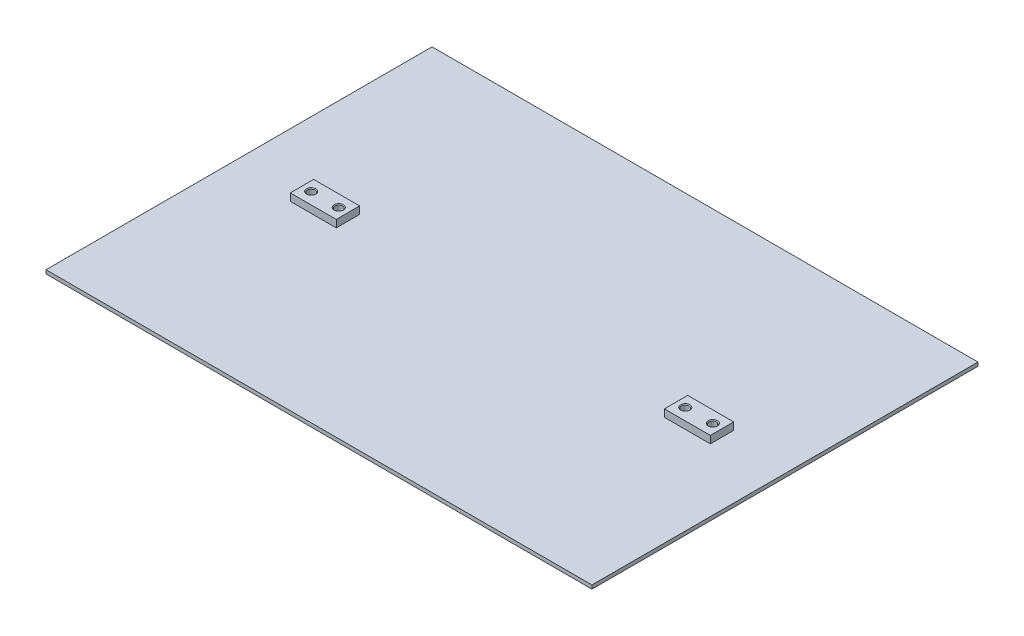
ISO-10303-21;
HEADER;
FILE_DESCRIPTION(('STEP AP214'),'2;1');
FILE_NAME('part.step','',(''),(''),'','','');
FILE_SCHEMA(('AUTOMOTIVE_DESIGN { 1 0 10303 214 1 1 1 1 }'));
ENDSEC;
DATA;
#1=APPLICATION_CONTEXT('core data for automotive mechanical design processes');
#2=APPLICATION_PROTOCOL_DEFINITION('international standard','automotive_design',2000,#1);
#3=PRODUCT_CONTEXT('',#1,'mechanical');
#4=PRODUCT('Part','Part','',(#3));
#5=PRODUCT_RELATED_PRODUCT_CATEGORY('part','',(#4));
#6=PRODUCT_DEFINITION_FORMATION('','',#4);
#7=PRODUCT_DEFINITION_CONTEXT('part definition',#1,'design');
#8=PRODUCT_DEFINITION('design','',#6,#7);
#9=PRODUCT_DEFINITION_SHAPE('','',#8);
#10=(LENGTH_UNIT() NAMED_UNIT(*) SI_UNIT(.MILLI.,.METRE.));
#11=(NAMED_UNIT(*) PLANE_ANGLE_UNIT() SI_UNIT($,.RADIAN.));
#12=(NAMED_UNIT(*) SI_UNIT($,.STERADIAN.) SOLID_ANGLE_UNIT());
#13=UNCERTAINTY_MEASURE_WITH_UNIT(LENGTH_MEASURE(1.E-05),#10,'distance_accuracy_value','');
#14=(GEOMETRIC_REPRESENTATION_CONTEXT(3) GLOBAL_UNCERTAINTY_ASSIGNED_CONTEXT((#13)) GLOBAL_UNIT_ASSIGNED_CONTEXT((#10,
#11,#12)) REPRESENTATION_CONTEXT('',''));
#15=CARTESIAN_POINT('',(0.,0.,0.));
#16=DIRECTION('',(0.,0.,1.));
#17=DIRECTION('',(1.,0.,0.));
#18=AXIS2_PLACEMENT_3D('',#15,#16,#17);
#19=CARTESIAN_POINT('',(0.,2.,0.));
#20=DIRECTION('',(0.,-1.,0.));
#21=DIRECTION('',(0.,0.,-1.));
#22=AXIS2_PLACEMENT_3D('',#19,#20,#21);
#23=PLANE('',#22);
#24=DIRECTION('',(0.,0.,-1.));
#25=VECTOR('',#24,1.);
#26=CARTESIAN_POINT('',(114.25,2.,6.35));
#27=LINE('',#26,#25);
#28=CARTESIAN_POINT('',(114.25,2.,6.35));
#29=VERTEX_POINT('',#28);
#30=CARTESIAN_POINT('',(114.25,2.,-6.35));
#31=VERTEX_POINT('',#30);
#32=EDGE_CURVE('E147',#29,#31,#27,.T.);
#33=ORIENTED_EDGE('',*,*,#32,.F.);
#34=DIRECTION('',(1.,0.,0.));
#35=VECTOR('',#34,1.);
#36=CARTESIAN_POINT('',(89.25,2.,6.35));
#37=LINE('',#36,#35);
#38=CARTESIAN_POINT('',(89.25,2.,6.35));
#39=VERTEX_POINT('',#38);
#40=EDGE_CURVE('E190',#39,#29,#37,.T.);
#41=ORIENTED_EDGE('',*,*,#40,.F.);
#42=DIRECTION('',(0.,0.,1.));
#43=VECTOR('',#42,1.);
#44=CARTESIAN_POINT('',(89.25,2.,6.35));
#45=LINE('',#44,#43);
#46=CARTESIAN_POINT('',(89.25,2.,-6.35));
#47=VERTEX_POINT('',#46);
#48=EDGE_CURVE('E207',#47,#39,#45,.T.);
#49=ORIENTED_EDGE('',*,*,#48,.F.);
#50=DIRECTION('',(-1.,0.,0.));
#51=VECTOR('',#50,1.);
#52=CARTESIAN_POINT('',(89.25,2.,-6.35));
#53=LINE('',#52,#51);
#54=EDGE_CURVE('E203',#31,#47,#53,.T.);
#55=ORIENTED_EDGE('',*,*,#54,.F.);
#56=EDGE_LOOP('',(#33,#41,#49,#55));
#57=FACE_BOUND('',#56,.T.);
#58=DIRECTION('',(0.,0.,-1.));
#59=VECTOR('',#58,1.);
#60=CARTESIAN_POINT('',(-148.5,2.,105.));
#61=LINE('',#60,#59);
#62=CARTESIAN_POINT('',(-148.5,2.,105.));
#63=VERTEX_POINT('',#62);
#64=CARTESIAN_POINT('',(-148.5,2.,-105.));
#65=VERTEX_POINT('',#64);
#66=EDGE_CURVE('E230',#63,#65,#61,.T.);
#67=ORIENTED_EDGE('',*,*,#66,.F.);
#68=DIRECTION('',(1.,0.,0.));
#69=VECTOR('',#68,1.);
#70=CARTESIAN_POINT('',(-148.5,2.,105.));
#71=LINE('',#70,#69);
#72=CARTESIAN_POINT('',(148.5,2.,105.));
#73=VERTEX_POINT('',#72);
#74=EDGE_CURVE('E242',#63,#73,#71,.T.);
#75=ORIENTED_EDGE('',*,*,#74,.T.);
#76=DIRECTION('',(0.,0.,-1.));
#77=VECTOR('',#76,1.);
#78=CARTESIAN_POINT('',(148.5,2.,105.));
#79=LINE('',#78,#77);
#80=CARTESIAN_POINT('',(148.5,2.,-105.));
#81=VERTEX_POINT('',#80);
#82=EDGE_CURVE('E239',#73,#81,#79,.T.);
#83=ORIENTED_EDGE('',*,*,#82,.T.);
#84=DIRECTION('',(1.,0.,0.));
#85=VECTOR('',#84,1.);
#86=CARTESIAN_POINT('',(-148.5,2.,-105.));
#87=LINE('',#86,#85);
#88=EDGE_CURVE('E234',#65,#81,#87,.T.);
#89=ORIENTED_EDGE('',*,*,#88,.F.);
#90=EDGE_LOOP('',(#67,#75,#83,#89));
#91=FACE_BOUND('',#90,.T.);
#92=DIRECTION('',(0.,0.,-1.));
#93=VECTOR('',#92,1.);
#94=CARTESIAN_POINT('',(-89.25,2.,6.35));
#95=LINE('',#94,#93);
#96=CARTESIAN_POINT('',(-89.25,2.,6.35));
#97=VERTEX_POINT('',#96);
#98=CARTESIAN_POINT('',(-89.25,2.,-6.35));
#99=VERTEX_POINT('',#98);
#100=EDGE_CURVE('E140',#97,#99,#95,.T.);
#101=ORIENTED_EDGE('',*,*,#100,.F.);
#102=DIRECTION('',(1.,0.,0.));
#103=VECTOR('',#102,1.);
#104=CARTESIAN_POINT('',(-89.25,2.,6.35));
#105=LINE('',#104,#103);
#106=CARTESIAN_POINT('',(-114.25,2.,6.35));
#107=VERTEX_POINT('',#106);
#108=EDGE_CURVE('E142',#107,#97,#105,.T.);
#109=ORIENTED_EDGE('',*,*,#108,.F.);
#110=DIRECTION('',(0.,0.,1.));
#111=VECTOR('',#110,1.);
#112=CARTESIAN_POINT('',(-114.25,2.,6.35));
#113=LINE('',#112,#111);
#114=CARTESIAN_POINT('',(-114.25,2.,-6.35));
#115=VERTEX_POINT('',#114);
#116=EDGE_CURVE('E76',#115,#107,#113,.T.);
#117=ORIENTED_EDGE('',*,*,#116,.F.);
#118=DIRECTION('',(-1.,0.,0.));
#119=VECTOR('',#118,1.);
#120=CARTESIAN_POINT('',(-89.25,2.,-6.35));
#121=LINE('',#120,#119);
#122=EDGE_CURVE('E71',#99,#115,#121,.T.);
#123=ORIENTED_EDGE('',*,*,#122,.F.);
#124=EDGE_LOOP('',(#101,#109,#117,#123));
#125=FACE_BOUND('',#124,.T.);
#126=ADVANCED_FACE('F53',(#57,#91,#125),#23,.F.);
#127=CARTESIAN_POINT('',(-148.5,2.,105.));
#128=DIRECTION('',(-1.,0.,0.));
#129=DIRECTION('',(0.,0.,1.));
#130=AXIS2_PLACEMENT_3D('',#127,#128,#129);
#131=PLANE('',#130);
#132=DIRECTION('',(0.,0.,-1.));
#133=VECTOR('',#132,1.);
#134=CARTESIAN_POINT('',(-148.5,0.,105.));
#135=LINE('',#134,#133);
#136=CARTESIAN_POINT('',(-148.5,0.,105.));
#137=VERTEX_POINT('',#136);
#138=CARTESIAN_POINT('',(-148.5,0.,-105.));
#139=VERTEX_POINT('',#138);
#140=EDGE_CURVE('E229',#137,#139,#135,.T.);
#141=ORIENTED_EDGE('',*,*,#140,.F.);
#142=DIRECTION('',(0.,-1.,0.));
#143=VECTOR('',#142,1.);
#144=CARTESIAN_POINT('',(-148.5,2.,105.));
#145=LINE('',#144,#143);
#146=EDGE_CURVE('E11',#63,#137,#145,.T.);
#147=ORIENTED_EDGE('',*,*,#146,.F.);
#148=ORIENTED_EDGE('',*,*,#66,.T.);
#149=DIRECTION('',(0.,-1.,0.));
#150=VECTOR('',#149,1.);
#151=CARTESIAN_POINT('',(-148.5,2.,-105.));
#152=LINE('',#151,#150);
#153=EDGE_CURVE('E57',#65,#139,#152,.T.);
#154=ORIENTED_EDGE('',*,*,#153,.T.);
#155=EDGE_LOOP('',(#141,#147,#148,#154));
#156=FACE_BOUND('',#155,.T.);
#157=ADVANCED_FACE('F55',(#156),#131,.T.);
#158=CARTESIAN_POINT('',(-148.5,2.,105.));
#159=DIRECTION('',(0.,0.,-1.));
#160=DIRECTION('',(-1.,0.,0.));
#161=AXIS2_PLACEMENT_3D('',#158,#159,#160);
#162=PLANE('',#161);
#163=DIRECTION('',(1.,0.,0.));
#164=VECTOR('',#163,1.);
#165=CARTESIAN_POINT('',(-148.5,0.,105.));
#166=LINE('',#165,#164);
#167=CARTESIAN_POINT('',(148.5,0.,105.));
#168=VERTEX_POINT('',#167);
#169=EDGE_CURVE('E235',#137,#168,#166,.T.);
#170=ORIENTED_EDGE('',*,*,#169,.T.);
#171=DIRECTION('',(0.,-1.,0.));
#172=VECTOR('',#171,1.);
#173=CARTESIAN_POINT('',(148.5,2.,105.));
#174=LINE('',#173,#172);
#175=EDGE_CURVE('E63',#73,#168,#174,.T.);
#176=ORIENTED_EDGE('',*,*,#175,.F.);
#177=ORIENTED_EDGE('',*,*,#74,.F.);
#178=ORIENTED_EDGE('',*,*,#146,.T.);
#179=EDGE_LOOP('',(#170,#176,#177,#178));
#180=FACE_BOUND('',#179,.T.);
#181=ADVANCED_FACE('F277',(#180),#162,.F.);
#182=CARTESIAN_POINT('',(148.5,2.,105.));
#183=DIRECTION('',(-1.,0.,0.));
#184=DIRECTION('',(0.,0.,1.));
#185=AXIS2_PLACEMENT_3D('',#182,#183,#184);
#186=PLANE('',#185);
#187=DIRECTION('',(0.,0.,-1.));
#188=VECTOR('',#187,1.);
#189=CARTESIAN_POINT('',(148.5,0.,105.));
#190=LINE('',#189,#188);
#191=CARTESIAN_POINT('',(148.5,0.,-105.));
#192=VERTEX_POINT('',#191);
#193=EDGE_CURVE('E252',#168,#192,#190,.T.);
#194=ORIENTED_EDGE('',*,*,#193,.T.);
#195=DIRECTION('',(0.,-1.,0.));
#196=VECTOR('',#195,1.);
#197=CARTESIAN_POINT('',(148.5,2.,-105.));
#198=LINE('',#197,#196);
#199=EDGE_CURVE('E260',#81,#192,#198,.T.);
#200=ORIENTED_EDGE('',*,*,#199,.F.);
#201=ORIENTED_EDGE('',*,*,#82,.F.);
#202=ORIENTED_EDGE('',*,*,#175,.T.);
#203=EDGE_LOOP('',(#194,#200,#201,#202));
#204=FACE_BOUND('',#203,.T.);
#205=ADVANCED_FACE('F281',(#204),#186,.F.);
#206=CARTESIAN_POINT('',(-148.5,2.,-105.));
#207=DIRECTION('',(0.,0.,-1.));
#208=DIRECTION('',(-1.,0.,0.));
#209=AXIS2_PLACEMENT_3D('',#206,#207,#208);
#210=PLANE('',#209);
#211=DIRECTION('',(1.,0.,0.));
#212=VECTOR('',#211,1.);
#213=CARTESIAN_POINT('',(-148.5,0.,-105.));
#214=LINE('',#213,#212);
#215=EDGE_CURVE('E248',#139,#192,#214,.T.);
#216=ORIENTED_EDGE('',*,*,#215,.F.);
#217=ORIENTED_EDGE('',*,*,#153,.F.);
#218=ORIENTED_EDGE('',*,*,#88,.T.);
#219=ORIENTED_EDGE('',*,*,#199,.T.);
#220=EDGE_LOOP('',(#216,#217,#218,#219));
#221=FACE_BOUND('',#220,.T.);
#222=ADVANCED_FACE('F270',(#221),#210,.T.);
#223=CARTESIAN_POINT('',(0.,0.,0.));
#224=DIRECTION('',(0.,-1.,0.));
#225=DIRECTION('',(0.,0.,-1.));
#226=AXIS2_PLACEMENT_3D('',#223,#224,#225);
#227=PLANE('',#226);
#228=CARTESIAN_POINT('',(109.25,0.,0.));
#229=DIRECTION('',(0.,1.,0.));
#230=DIRECTION('',(0.,0.,1.));
#231=AXIS2_PLACEMENT_3D('',#228,#229,#230);
#232=CIRCLE('',#231,2.1);
#233=CARTESIAN_POINT('',(109.25,0.,2.1));
#234=VERTEX_POINT('',#233);
#235=EDGE_CURVE('E576',#234,#234,#232,.T.);
#236=ORIENTED_EDGE('',*,*,#235,.T.);
#237=EDGE_LOOP('',(#236));
#238=FACE_BOUND('',#237,.T.);
#239=CARTESIAN_POINT('',(94.25,0.,0.));
#240=DIRECTION('',(0.,1.,0.));
#241=DIRECTION('',(0.,0.,1.));
#242=AXIS2_PLACEMENT_3D('',#239,#240,#241);
#243=CIRCLE('',#242,2.1);
#244=CARTESIAN_POINT('',(94.25,0.,2.1));
#245=VERTEX_POINT('',#244);
#246=EDGE_CURVE('E590',#245,#245,#243,.T.);
#247=ORIENTED_EDGE('',*,*,#246,.T.);
#248=EDGE_LOOP('',(#247));
#249=FACE_BOUND('',#248,.T.);
#250=CARTESIAN_POINT('',(-94.25,0.,0.));
#251=DIRECTION('',(0.,1.,0.));
#252=DIRECTION('',(0.,0.,1.));
#253=AXIS2_PLACEMENT_3D('',#250,#251,#252);
#254=CIRCLE('',#253,2.1);
#255=CARTESIAN_POINT('',(-94.25,0.,2.1));
#256=VERTEX_POINT('',#255);
#257=EDGE_CURVE('E602',#256,#256,#254,.T.);
#258=ORIENTED_EDGE('',*,*,#257,.T.);
#259=EDGE_LOOP('',(#258));
#260=FACE_BOUND('',#259,.T.);
#261=CARTESIAN_POINT('',(-109.25,0.,0.));
#262=DIRECTION('',(0.,1.,0.));
#263=DIRECTION('',(0.,0.,1.));
#264=AXIS2_PLACEMENT_3D('',#261,#262,#263);
#265=CIRCLE('',#264,2.1);
#266=CARTESIAN_POINT('',(-109.25,0.,2.1));
#267=VERTEX_POINT('',#266);
#268=EDGE_CURVE('E614',#267,#267,#265,.T.);
#269=ORIENTED_EDGE('',*,*,#268,.T.);
#270=EDGE_LOOP('',(#269));
#271=FACE_BOUND('',#270,.T.);
#272=ORIENTED_EDGE('',*,*,#140,.T.);
#273=ORIENTED_EDGE('',*,*,#215,.T.);
#274=ORIENTED_EDGE('',*,*,#193,.F.);
#275=ORIENTED_EDGE('',*,*,#169,.F.);
#276=EDGE_LOOP('',(#272,#273,#274,#275));
#277=FACE_BOUND('',#276,.T.);
#278=ADVANCED_FACE('F274',(#238,#249,#260,#271,#277),#227,.T.);
#279=CARTESIAN_POINT('',(114.25,6.,6.35));
#280=DIRECTION('',(-1.,0.,0.));
#281=DIRECTION('',(0.,0.,1.));
#282=AXIS2_PLACEMENT_3D('',#279,#280,#281);
#283=PLANE('',#282);
#284=ORIENTED_EDGE('',*,*,#32,.T.);
#285=DIRECTION('',(0.,-1.,0.));
#286=VECTOR('',#285,1.);
#287=CARTESIAN_POINT('',(114.25,6.,-6.35));
#288=LINE('',#287,#286);
#289=CARTESIAN_POINT('',(114.25,6.,-6.35));
#290=VERTEX_POINT('',#289);
#291=EDGE_CURVE('E225',#290,#31,#288,.T.);
#292=ORIENTED_EDGE('',*,*,#291,.F.);
#293=DIRECTION('',(0.,0.,-1.));
#294=VECTOR('',#293,1.);
#295=CARTESIAN_POINT('',(114.25,6.,6.35));
#296=LINE('',#295,#294);
#297=CARTESIAN_POINT('',(114.25,6.,6.35));
#298=VERTEX_POINT('',#297);
#299=EDGE_CURVE('E185',#298,#290,#296,.T.);
#300=ORIENTED_EDGE('',*,*,#299,.F.);
#301=DIRECTION('',(0.,-1.,0.));
#302=VECTOR('',#301,1.);
#303=CARTESIAN_POINT('',(114.25,6.,6.35));
#304=LINE('',#303,#302);
#305=EDGE_CURVE('E199',#298,#29,#304,.T.);
#306=ORIENTED_EDGE('',*,*,#305,.T.);
#307=EDGE_LOOP('',(#284,#292,#300,#306));
#308=FACE_BOUND('',#307,.T.);
#309=ADVANCED_FACE('F293',(#308),#283,.F.);
#310=CARTESIAN_POINT('',(89.25,6.,-6.35));
#311=DIRECTION('',(0.,0.,1.));
#312=DIRECTION('',(1.,0.,0.));
#313=AXIS2_PLACEMENT_3D('',#310,#311,#312);
#314=PLANE('',#313);
#315=ORIENTED_EDGE('',*,*,#54,.T.);
#316=DIRECTION('',(0.,-1.,0.));
#317=VECTOR('',#316,1.);
#318=CARTESIAN_POINT('',(89.25,6.,-6.35));
#319=LINE('',#318,#317);
#320=CARTESIAN_POINT('',(89.25,6.,-6.35));
#321=VERTEX_POINT('',#320);
#322=EDGE_CURVE('E221',#321,#47,#319,.T.);
#323=ORIENTED_EDGE('',*,*,#322,.F.);
#324=DIRECTION('',(-1.,0.,0.));
#325=VECTOR('',#324,1.);
#326=CARTESIAN_POINT('',(89.25,6.,-6.35));
#327=LINE('',#326,#325);
#328=EDGE_CURVE('E189',#290,#321,#327,.T.);
#329=ORIENTED_EDGE('',*,*,#328,.F.);
#330=ORIENTED_EDGE('',*,*,#291,.T.);
#331=EDGE_LOOP('',(#315,#323,#329,#330));
#332=FACE_BOUND('',#331,.T.);
#333=ADVANCED_FACE('F338',(#332),#314,.F.);
#334=CARTESIAN_POINT('',(89.25,6.,6.35));
#335=DIRECTION('',(1.,0.,0.));
#336=DIRECTION('',(0.,0.,-1.));
#337=AXIS2_PLACEMENT_3D('',#334,#335,#336);
#338=PLANE('',#337);
#339=ORIENTED_EDGE('',*,*,#48,.T.);
#340=DIRECTION('',(0.,-1.,0.));
#341=VECTOR('',#340,1.);
#342=CARTESIAN_POINT('',(89.25,6.,6.35));
#343=LINE('',#342,#341);
#344=CARTESIAN_POINT('',(89.25,6.,6.35));
#345=VERTEX_POINT('',#344);
#346=EDGE_CURVE('E217',#345,#39,#343,.T.);
#347=ORIENTED_EDGE('',*,*,#346,.F.);
#348=DIRECTION('',(0.,0.,1.));
#349=VECTOR('',#348,1.);
#350=CARTESIAN_POINT('',(89.25,6.,6.35));
#351=LINE('',#350,#349);
#352=EDGE_CURVE('E193',#321,#345,#351,.T.);
#353=ORIENTED_EDGE('',*,*,#352,.F.);
#354=ORIENTED_EDGE('',*,*,#322,.T.);
#355=EDGE_LOOP('',(#339,#347,#353,#354));
#356=FACE_BOUND('',#355,.T.);
#357=ADVANCED_FACE('F346',(#356),#338,.F.);
#358=CARTESIAN_POINT('',(89.25,6.,6.35));
#359=DIRECTION('',(0.,0.,-1.));
#360=DIRECTION('',(-1.,0.,0.));
#361=AXIS2_PLACEMENT_3D('',#358,#359,#360);
#362=PLANE('',#361);
#363=ORIENTED_EDGE('',*,*,#40,.T.);
#364=ORIENTED_EDGE('',*,*,#305,.F.);
#365=DIRECTION('',(1.,0.,0.));
#366=VECTOR('',#365,1.);
#367=CARTESIAN_POINT('',(89.25,6.,6.35));
#368=LINE('',#367,#366);
#369=EDGE_CURVE('E196',#345,#298,#368,.T.);
#370=ORIENTED_EDGE('',*,*,#369,.F.);
#371=ORIENTED_EDGE('',*,*,#346,.T.);
#372=EDGE_LOOP('',(#363,#364,#370,#371));
#373=FACE_BOUND('',#372,.T.);
#374=ADVANCED_FACE('F354',(#373),#362,.F.);
#375=CARTESIAN_POINT('',(0.,6.,0.));
#376=DIRECTION('',(0.,-1.,0.));
#377=DIRECTION('',(0.,0.,-1.));
#378=AXIS2_PLACEMENT_3D('',#375,#376,#377);
#379=PLANE('',#378);
#380=CARTESIAN_POINT('',(109.25,6.,0.));
#381=DIRECTION('',(0.,1.,0.));
#382=DIRECTION('',(0.,0.,1.));
#383=AXIS2_PLACEMENT_3D('',#380,#381,#382);
#384=CIRCLE('',#383,2.525);
#385=CARTESIAN_POINT('',(109.25,6.,2.525));
#386=VERTEX_POINT('',#385);
#387=EDGE_CURVE('E572',#386,#386,#384,.T.);
#388=ORIENTED_EDGE('',*,*,#387,.F.);
#389=EDGE_LOOP('',(#388));
#390=FACE_BOUND('',#389,.T.);
#391=CARTESIAN_POINT('',(94.25,6.,0.));
#392=DIRECTION('',(0.,1.,0.));
#393=DIRECTION('',(0.,0.,1.));
#394=AXIS2_PLACEMENT_3D('',#391,#392,#393);
#395=CIRCLE('',#394,2.525);
#396=CARTESIAN_POINT('',(94.25,6.,2.525));
#397=VERTEX_POINT('',#396);
#398=EDGE_CURVE('E582',#397,#397,#395,.T.);
#399=ORIENTED_EDGE('',*,*,#398,.F.);
#400=EDGE_LOOP('',(#399));
#401=FACE_BOUND('',#400,.T.);
#402=ORIENTED_EDGE('',*,*,#299,.T.);
#403=ORIENTED_EDGE('',*,*,#328,.T.);
#404=ORIENTED_EDGE('',*,*,#352,.T.);
#405=ORIENTED_EDGE('',*,*,#369,.T.);
#406=EDGE_LOOP('',(#402,#403,#404,#405));
#407=FACE_BOUND('',#406,.T.);
#408=ADVANCED_FACE('F363',(#390,#401,#407),#379,.F.);
#409=CARTESIAN_POINT('',(-89.25,6.,6.35));
#410=DIRECTION('',(-1.,0.,0.));
#411=DIRECTION('',(0.,0.,1.));
#412=AXIS2_PLACEMENT_3D('',#409,#410,#411);
#413=PLANE('',#412);
#414=ORIENTED_EDGE('',*,*,#100,.T.);
#415=DIRECTION('',(0.,-1.,0.));
#416=VECTOR('',#415,1.);
#417=CARTESIAN_POINT('',(-89.25,6.,-6.35));
#418=LINE('',#417,#416);
#419=CARTESIAN_POINT('',(-89.25,6.,-6.35));
#420=VERTEX_POINT('',#419);
#421=EDGE_CURVE('E618',#420,#99,#418,.T.);
#422=ORIENTED_EDGE('',*,*,#421,.F.);
#423=DIRECTION('',(0.,0.,-1.));
#424=VECTOR('',#423,1.);
#425=CARTESIAN_POINT('',(-89.25,6.,6.35));
#426=LINE('',#425,#424);
#427=CARTESIAN_POINT('',(-89.25,6.,6.35));
#428=VERTEX_POINT('',#427);
#429=EDGE_CURVE('E159',#428,#420,#426,.T.);
#430=ORIENTED_EDGE('',*,*,#429,.F.);
#431=DIRECTION('',(0.,-1.,0.));
#432=VECTOR('',#431,1.);
#433=CARTESIAN_POINT('',(-89.25,6.,6.35));
#434=LINE('',#433,#432);
#435=EDGE_CURVE('E154',#428,#97,#434,.T.);
#436=ORIENTED_EDGE('',*,*,#435,.T.);
#437=EDGE_LOOP('',(#414,#422,#430,#436));
#438=FACE_BOUND('',#437,.T.);
#439=ADVANCED_FACE('F161',(#438),#413,.F.);
#440=CARTESIAN_POINT('',(-89.25,6.,-6.35));
#441=DIRECTION('',(0.,0.,1.));
#442=DIRECTION('',(1.,0.,0.));
#443=AXIS2_PLACEMENT_3D('',#440,#441,#442);
#444=PLANE('',#443);
#445=ORIENTED_EDGE('',*,*,#122,.T.);
#446=DIRECTION('',(0.,-1.,0.));
#447=VECTOR('',#446,1.);
#448=CARTESIAN_POINT('',(-114.25,6.,-6.35));
#449=LINE('',#448,#447);
#450=CARTESIAN_POINT('',(-114.25,6.,-6.35));
#451=VERTEX_POINT('',#450);
#452=EDGE_CURVE('E170',#451,#115,#449,.T.);
#453=ORIENTED_EDGE('',*,*,#452,.F.);
#454=DIRECTION('',(-1.,0.,0.));
#455=VECTOR('',#454,1.);
#456=CARTESIAN_POINT('',(-89.25,6.,-6.35));
#457=LINE('',#456,#455);
#458=EDGE_CURVE('E180',#420,#451,#457,.T.);
#459=ORIENTED_EDGE('',*,*,#458,.F.);
#460=ORIENTED_EDGE('',*,*,#421,.T.);
#461=EDGE_LOOP('',(#445,#453,#459,#460));
#462=FACE_BOUND('',#461,.T.);
#463=ADVANCED_FACE('F380',(#462),#444,.F.);
#464=CARTESIAN_POINT('',(-114.25,6.,6.35));
#465=DIRECTION('',(1.,0.,0.));
#466=DIRECTION('',(0.,0.,-1.));
#467=AXIS2_PLACEMENT_3D('',#464,#465,#466);
#468=PLANE('',#467);
#469=ORIENTED_EDGE('',*,*,#116,.T.);
#470=DIRECTION('',(0.,-1.,0.));
#471=VECTOR('',#470,1.);
#472=CARTESIAN_POINT('',(-114.25,6.,6.35));
#473=LINE('',#472,#471);
#474=CARTESIAN_POINT('',(-114.25,6.,6.35));
#475=VERTEX_POINT('',#474);
#476=EDGE_CURVE('E157',#475,#107,#473,.T.);
#477=ORIENTED_EDGE('',*,*,#476,.F.);
#478=DIRECTION('',(0.,0.,1.));
#479=VECTOR('',#478,1.);
#480=CARTESIAN_POINT('',(-114.25,6.,6.35));
#481=LINE('',#480,#479);
#482=EDGE_CURVE('E168',#451,#475,#481,.T.);
#483=ORIENTED_EDGE('',*,*,#482,.F.);
#484=ORIENTED_EDGE('',*,*,#452,.T.);
#485=EDGE_LOOP('',(#469,#477,#483,#484));
#486=FACE_BOUND('',#485,.T.);
#487=ADVANCED_FACE('F388',(#486),#468,.F.);
#488=CARTESIAN_POINT('',(-89.25,6.,6.35));
#489=DIRECTION('',(0.,0.,-1.));
#490=DIRECTION('',(-1.,0.,0.));
#491=AXIS2_PLACEMENT_3D('',#488,#489,#490);
#492=PLANE('',#491);
#493=ORIENTED_EDGE('',*,*,#108,.T.);
#494=ORIENTED_EDGE('',*,*,#435,.F.);
#495=DIRECTION('',(1.,0.,0.));
#496=VECTOR('',#495,1.);
#497=CARTESIAN_POINT('',(-89.25,6.,6.35));
#498=LINE('',#497,#496);
#499=EDGE_CURVE('E164',#475,#428,#498,.T.);
#500=ORIENTED_EDGE('',*,*,#499,.F.);
#501=ORIENTED_EDGE('',*,*,#476,.T.);
#502=EDGE_LOOP('',(#493,#494,#500,#501));
#503=FACE_BOUND('',#502,.T.);
#504=ADVANCED_FACE('F152',(#503),#492,.F.);
#505=CARTESIAN_POINT('',(0.,6.,0.));
#506=DIRECTION('',(0.,1.,0.));
#507=DIRECTION('',(0.,0.,1.));
#508=AXIS2_PLACEMENT_3D('',#505,#506,#507);
#509=PLANE('',#508);
#510=CARTESIAN_POINT('',(-94.25,6.,0.));
#511=DIRECTION('',(0.,1.,0.));
#512=DIRECTION('',(0.,0.,1.));
#513=AXIS2_PLACEMENT_3D('',#510,#511,#512);
#514=CIRCLE('',#513,2.525);
#515=CARTESIAN_POINT('',(-94.25,6.,2.525));
#516=VERTEX_POINT('',#515);
#517=EDGE_CURVE('E594',#516,#516,#514,.T.);
#518=ORIENTED_EDGE('',*,*,#517,.F.);
#519=EDGE_LOOP('',(#518));
#520=FACE_BOUND('',#519,.T.);
#521=CARTESIAN_POINT('',(-109.25,6.,0.));
#522=DIRECTION('',(0.,1.,0.));
#523=DIRECTION('',(0.,0.,1.));
#524=AXIS2_PLACEMENT_3D('',#521,#522,#523);
#525=CIRCLE('',#524,2.525);
#526=CARTESIAN_POINT('',(-109.25,6.,2.525));
#527=VERTEX_POINT('',#526);
#528=EDGE_CURVE('E606',#527,#527,#525,.T.);
#529=ORIENTED_EDGE('',*,*,#528,.F.);
#530=EDGE_LOOP('',(#529));
#531=FACE_BOUND('',#530,.T.);
#532=ORIENTED_EDGE('',*,*,#429,.T.);
#533=ORIENTED_EDGE('',*,*,#458,.T.);
#534=ORIENTED_EDGE('',*,*,#482,.T.);
#535=ORIENTED_EDGE('',*,*,#499,.T.);
#536=EDGE_LOOP('',(#532,#533,#534,#535));
#537=FACE_BOUND('',#536,.T.);
#538=ADVANCED_FACE('F405',(#520,#531,#537),#509,.T.);
#539=CARTESIAN_POINT('',(-109.25,6.,0.));
#540=DIRECTION('',(0.,1.,0.));
#541=DIRECTION('',(0.,0.,1.));
#542=AXIS2_PLACEMENT_3D('',#539,#540,#541);
#543=CYLINDRICAL_SURFACE('',#542,2.1);
#544=ORIENTED_EDGE('',*,*,#268,.F.);
#545=EDGE_LOOP('',(#544));
#546=FACE_BOUND('',#545,.T.);
#547=CARTESIAN_POINT('',(-109.25,5.57499999999999,0.));
#548=DIRECTION('',(0.,1.,0.));
#549=DIRECTION('',(0.,0.,1.));
#550=AXIS2_PLACEMENT_3D('',#547,#548,#549);
#551=CIRCLE('',#550,2.09999999999999);
#552=CARTESIAN_POINT('',(-109.25,5.57499999999999,2.09999999999999));
#553=VERTEX_POINT('',#552);
#554=EDGE_CURVE('E610',#553,#553,#551,.T.);
#555=ORIENTED_EDGE('',*,*,#554,.T.);
#556=EDGE_LOOP('',(#555));
#557=FACE_BOUND('',#556,.T.);
#558=ADVANCED_FACE('F413',(#546,#557),#543,.F.);
#559=CARTESIAN_POINT('',(-109.25,6.,0.));
#560=DIRECTION('',(0.,1.,0.));
#561=DIRECTION('',(0.,0.,1.));
#562=AXIS2_PLACEMENT_3D('',#559,#560,#561);
#563=CONICAL_SURFACE('',#562,2.525,0.785398163397446);
#564=ORIENTED_EDGE('',*,*,#554,.F.);
#565=EDGE_LOOP('',(#564));
#566=FACE_BOUND('',#565,.T.);
#567=ORIENTED_EDGE('',*,*,#528,.T.);
#568=EDGE_LOOP('',(#567));
#569=FACE_BOUND('',#568,.T.);
#570=ADVANCED_FACE('F422',(#566,#569),#563,.F.);
#571=CARTESIAN_POINT('',(-94.25,6.,0.));
#572=DIRECTION('',(0.,1.,0.));
#573=DIRECTION('',(0.,0.,1.));
#574=AXIS2_PLACEMENT_3D('',#571,#572,#573);
#575=CYLINDRICAL_SURFACE('',#574,2.1);
#576=ORIENTED_EDGE('',*,*,#257,.F.);
#577=EDGE_LOOP('',(#576));
#578=FACE_BOUND('',#577,.T.);
#579=CARTESIAN_POINT('',(-94.25,5.57499999999999,0.));
#580=DIRECTION('',(0.,1.,0.));
#581=DIRECTION('',(0.,0.,1.));
#582=AXIS2_PLACEMENT_3D('',#579,#580,#581);
#583=CIRCLE('',#582,2.09999999999999);
#584=CARTESIAN_POINT('',(-94.25,5.57499999999999,2.09999999999999));
#585=VERTEX_POINT('',#584);
#586=EDGE_CURVE('E598',#585,#585,#583,.T.);
#587=ORIENTED_EDGE('',*,*,#586,.T.);
#588=EDGE_LOOP('',(#587));
#589=FACE_BOUND('',#588,.T.);
#590=ADVANCED_FACE('F432',(#578,#589),#575,.F.);
#591=CARTESIAN_POINT('',(-94.25,6.,0.));
#592=DIRECTION('',(0.,1.,0.));
#593=DIRECTION('',(0.,0.,1.));
#594=AXIS2_PLACEMENT_3D('',#591,#592,#593);
#595=CONICAL_SURFACE('',#594,2.525,0.785398163397446);
#596=ORIENTED_EDGE('',*,*,#586,.F.);
#597=EDGE_LOOP('',(#596));
#598=FACE_BOUND('',#597,.T.);
#599=ORIENTED_EDGE('',*,*,#517,.T.);
#600=EDGE_LOOP('',(#599));
#601=FACE_BOUND('',#600,.T.);
#602=ADVANCED_FACE('F442',(#598,#601),#595,.F.);
#603=CARTESIAN_POINT('',(94.25,6.,0.));
#604=DIRECTION('',(0.,1.,0.));
#605=DIRECTION('',(0.,0.,1.));
#606=AXIS2_PLACEMENT_3D('',#603,#604,#605);
#607=CYLINDRICAL_SURFACE('',#606,2.1);
#608=ORIENTED_EDGE('',*,*,#246,.F.);
#609=EDGE_LOOP('',(#608));
#610=FACE_BOUND('',#609,.T.);
#611=CARTESIAN_POINT('',(94.25,5.57499999999999,0.));
#612=DIRECTION('',(0.,1.,0.));
#613=DIRECTION('',(0.,0.,1.));
#614=AXIS2_PLACEMENT_3D('',#611,#612,#613);
#615=CIRCLE('',#614,2.09999999999999);
#616=CARTESIAN_POINT('',(94.25,5.57499999999999,2.09999999999999));
#617=VERTEX_POINT('',#616);
#618=EDGE_CURVE('E586',#617,#617,#615,.T.);
#619=ORIENTED_EDGE('',*,*,#618,.T.);
#620=EDGE_LOOP('',(#619));
#621=FACE_BOUND('',#620,.T.);
#622=ADVANCED_FACE('F452',(#610,#621),#607,.F.);
#623=CARTESIAN_POINT('',(94.25,6.,0.));
#624=DIRECTION('',(0.,1.,0.));
#625=DIRECTION('',(0.,0.,1.));
#626=AXIS2_PLACEMENT_3D('',#623,#624,#625);
#627=CONICAL_SURFACE('',#626,2.525,0.785398163397446);
#628=ORIENTED_EDGE('',*,*,#618,.F.);
#629=EDGE_LOOP('',(#628));
#630=FACE_BOUND('',#629,.T.);
#631=ORIENTED_EDGE('',*,*,#398,.T.);
#632=EDGE_LOOP('',(#631));
#633=FACE_BOUND('',#632,.T.);
#634=ADVANCED_FACE('F462',(#630,#633),#627,.F.);
#635=CARTESIAN_POINT('',(109.25,6.,0.));
#636=DIRECTION('',(0.,1.,0.));
#637=DIRECTION('',(0.,0.,1.));
#638=AXIS2_PLACEMENT_3D('',#635,#636,#637);
#639=CYLINDRICAL_SURFACE('',#638,2.1);
#640=ORIENTED_EDGE('',*,*,#235,.F.);
#641=EDGE_LOOP('',(#640));
#642=FACE_BOUND('',#641,.T.);
#643=CARTESIAN_POINT('',(109.25,5.57499999999999,0.));
#644=DIRECTION('',(0.,1.,0.));
#645=DIRECTION('',(0.,0.,1.));
#646=AXIS2_PLACEMENT_3D('',#643,#644,#645);
#647=CIRCLE('',#646,2.09999999999999);
#648=CARTESIAN_POINT('',(109.25,5.57499999999999,2.09999999999999));
#649=VERTEX_POINT('',#648);
#650=EDGE_CURVE('E569',#649,#649,#647,.T.);
#651=ORIENTED_EDGE('',*,*,#650,.T.);
#652=EDGE_LOOP('',(#651));
#653=FACE_BOUND('',#652,.T.);
#654=ADVANCED_FACE('F472',(#642,#653),#639,.F.);
#655=CARTESIAN_POINT('',(109.25,6.,0.));
#656=DIRECTION('',(0.,1.,0.));
#657=DIRECTION('',(0.,0.,1.));
#658=AXIS2_PLACEMENT_3D('',#655,#656,#657);
#659=CONICAL_SURFACE('',#658,2.525,0.785398163397446);
#660=ORIENTED_EDGE('',*,*,#650,.F.);
#661=EDGE_LOOP('',(#660));
#662=FACE_BOUND('',#661,.T.);
#663=ORIENTED_EDGE('',*,*,#387,.T.);
#664=EDGE_LOOP('',(#663));
#665=FACE_BOUND('',#664,.T.);
#666=ADVANCED_FACE('F482',(#662,#665),#659,.F.);
#667=CLOSED_SHELL('',(#126,#157,#181,#205,#222,#278,#309,#333,#357,#374,#408,#439,#463,#487,
#504,#538,#558,#570,#590,#602,#622,#634,#654,#666));
#668=MANIFOLD_SOLID_BREP('B2',#667);
#669=ADVANCED_BREP_SHAPE_REPRESENTATION('',(#18,#668),#14);
#670=SHAPE_DEFINITION_REPRESENTATION(#9,#669);
ENDSEC;
END-ISO-10303-21;
